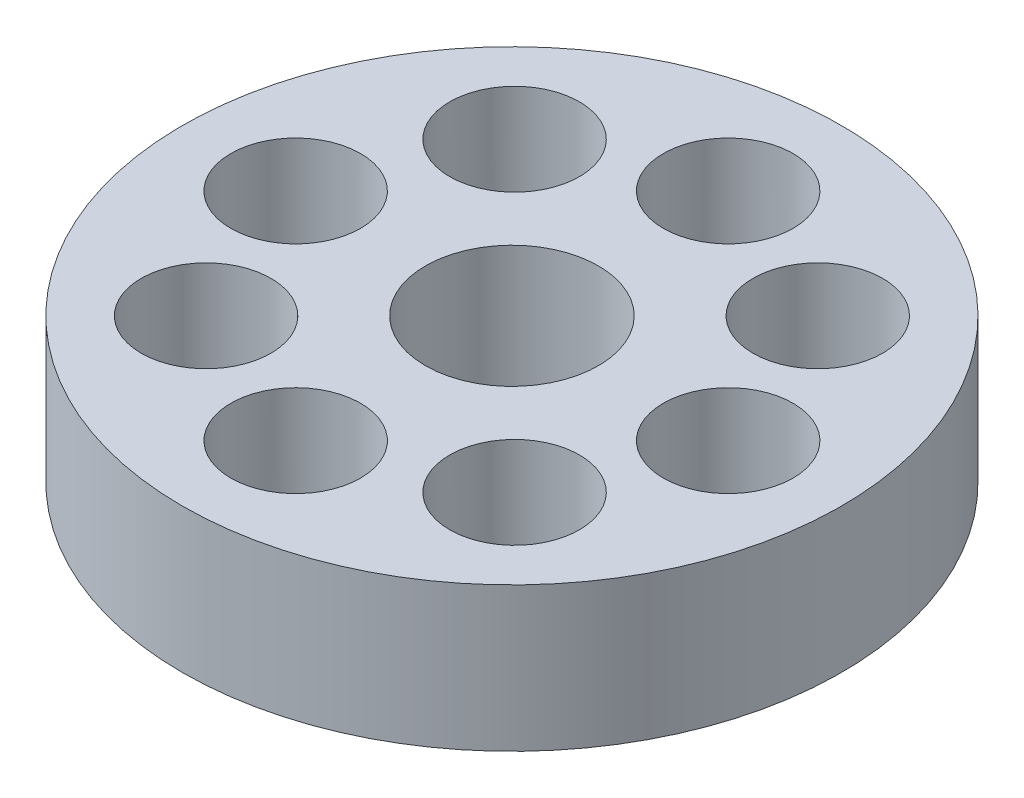
ISO-10303-21;
HEADER;
FILE_DESCRIPTION(('STEP AP214'),'2;1');
FILE_NAME('part.step','',(''),(''),'','','');
FILE_SCHEMA(('AUTOMOTIVE_DESIGN { 1 0 10303 214 1 1 1 1 }'));
ENDSEC;
DATA;
#1=APPLICATION_CONTEXT('core data for automotive mechanical design processes');
#2=APPLICATION_PROTOCOL_DEFINITION('international standard','automotive_design',2000,#1);
#3=PRODUCT_CONTEXT('',#1,'mechanical');
#4=PRODUCT('Part','Part','',(#3));
#5=PRODUCT_RELATED_PRODUCT_CATEGORY('part','',(#4));
#6=PRODUCT_DEFINITION_FORMATION('','',#4);
#7=PRODUCT_DEFINITION_CONTEXT('part definition',#1,'design');
#8=PRODUCT_DEFINITION('design','',#6,#7);
#9=PRODUCT_DEFINITION_SHAPE('','',#8);
#10=(LENGTH_UNIT() NAMED_UNIT(*) SI_UNIT(.MILLI.,.METRE.));
#11=(NAMED_UNIT(*) PLANE_ANGLE_UNIT() SI_UNIT($,.RADIAN.));
#12=(NAMED_UNIT(*) SI_UNIT($,.STERADIAN.) SOLID_ANGLE_UNIT());
#13=UNCERTAINTY_MEASURE_WITH_UNIT(LENGTH_MEASURE(1.E-05),#10,'distance_accuracy_value','');
#14=(GEOMETRIC_REPRESENTATION_CONTEXT(3) GLOBAL_UNCERTAINTY_ASSIGNED_CONTEXT((#13)) GLOBAL_UNIT_ASSIGNED_CONTEXT((#10,
#11,#12)) REPRESENTATION_CONTEXT('',''));
#15=CARTESIAN_POINT('',(0.,0.,0.));
#16=DIRECTION('',(0.,0.,1.));
#17=DIRECTION('',(1.,0.,0.));
#18=AXIS2_PLACEMENT_3D('',#15,#16,#17);
#19=CARTESIAN_POINT('',(0.,0.,0.));
#20=DIRECTION('',(0.,1.,0.));
#21=DIRECTION('',(0.,0.,1.));
#22=AXIS2_PLACEMENT_3D('',#19,#20,#21);
#23=PLANE('',#22);
#24=CARTESIAN_POINT('',(0.,0.,0.));
#25=DIRECTION('',(0.,1.,0.));
#26=DIRECTION('',(0.,0.,1.));
#27=AXIS2_PLACEMENT_3D('',#24,#25,#26);
#28=CIRCLE('',#27,30.);
#29=CARTESIAN_POINT('',(0.,0.,30.));
#30=VERTEX_POINT('',#29);
#31=EDGE_CURVE('E374',#30,#30,#28,.T.);
#32=ORIENTED_EDGE('',*,*,#31,.T.);
#33=EDGE_LOOP('',(#32));
#34=FACE_BOUND('',#33,.T.);
#35=CARTESIAN_POINT('',(0.,0.,0.));
#36=DIRECTION('',(0.,1.,0.));
#37=DIRECTION('',(0.,0.,1.));
#38=AXIS2_PLACEMENT_3D('',#35,#36,#37);
#39=CIRCLE('',#38,60.);
#40=CARTESIAN_POINT('',(14.8823511247383,0.,58.125));
#41=VERTEX_POINT('',#40);
#42=CARTESIAN_POINT('',(31.0217602708352,0.,51.3580606107633));
#43=VERTEX_POINT('',#42);
#44=EDGE_CURVE('E274',#41,#43,#39,.T.);
#45=ORIENTED_EDGE('',*,*,#44,.F.);
#46=CARTESIAN_POINT('',(0.,0.,75.));
#47=DIRECTION('',(0.,1.,0.));
#48=DIRECTION('',(0.,0.,1.));
#49=AXIS2_PLACEMENT_3D('',#46,#47,#48);
#50=CIRCLE('',#49,22.5);
#51=CARTESIAN_POINT('',(-14.8823511247383,0.,58.125));
#52=VERTEX_POINT('',#51);
#53=EDGE_CURVE('E272',#41,#52,#50,.T.);
#54=ORIENTED_EDGE('',*,*,#53,.T.);
#55=CARTESIAN_POINT('',(-30.5790945217529,0.,51.6228532554111));
#56=VERTEX_POINT('',#55);
#57=EDGE_CURVE('E278',#56,#52,#39,.T.);
#58=ORIENTED_EDGE('',*,*,#57,.F.);
#59=CARTESIAN_POINT('',(-53.0349853600991,0.,53.0310317441974));
#60=DIRECTION('',(0.,1.,0.));
#61=DIRECTION('',(0.,0.,1.));
#62=AXIS2_PLACEMENT_3D('',#59,#60,#61);
#63=CIRCLE('',#62,22.5);
#64=CARTESIAN_POINT('',(-51.6251327864007,0.,30.575245948095));
#65=VERTEX_POINT('',#64);
#66=EDGE_CURVE('E398',#56,#65,#63,.T.);
#67=ORIENTED_EDGE('',*,*,#66,.T.);
#68=CARTESIAN_POINT('',(-58.125,0.,14.8823511247383));
#69=VERTEX_POINT('',#68);
#70=EDGE_CURVE('E291',#69,#65,#39,.T.);
#71=ORIENTED_EDGE('',*,*,#70,.F.);
#72=CARTESIAN_POINT('',(-75.,0.,0.));
#73=DIRECTION('',(0.,1.,0.));
#74=DIRECTION('',(0.,0.,1.));
#75=AXIS2_PLACEMENT_3D('',#72,#73,#74);
#76=CIRCLE('',#75,22.5);
#77=CARTESIAN_POINT('',(-58.125,0.,-14.8823511247383));
#78=VERTEX_POINT('',#77);
#79=EDGE_CURVE('E405',#69,#78,#76,.T.);
#80=ORIENTED_EDGE('',*,*,#79,.T.);
#81=CARTESIAN_POINT('',(-51.3580606107636,0.,-31.0217602708346));
#82=VERTEX_POINT('',#81);
#83=EDGE_CURVE('E298',#82,#78,#39,.T.);
#84=ORIENTED_EDGE('',*,*,#83,.F.);
#85=CARTESIAN_POINT('',(-52.5731363363045,0.,-53.4889272257758));
#86=DIRECTION('',(0.,1.,0.));
#87=DIRECTION('',(0.,0.,1.));
#88=AXIS2_PLACEMENT_3D('',#85,#86,#87);
#89=CIRCLE('',#88,22.5);
#90=CARTESIAN_POINT('',(-30.1303007105084,0.,-51.8860769291179));
#91=VERTEX_POINT('',#90);
#92=EDGE_CURVE('E412',#82,#91,#89,.T.);
#93=ORIENTED_EDGE('',*,*,#92,.T.);
#94=CARTESIAN_POINT('',(-14.8823511247383,0.,-58.125));
#95=VERTEX_POINT('',#94);
#96=EDGE_CURVE('E305',#95,#91,#39,.T.);
#97=ORIENTED_EDGE('',*,*,#96,.F.);
#98=CARTESIAN_POINT('',(0.,0.,-75.));
#99=DIRECTION('',(0.,1.,0.));
#100=DIRECTION('',(0.,0.,1.));
#101=AXIS2_PLACEMENT_3D('',#98,#99,#100);
#102=CIRCLE('',#101,22.5);
#103=CARTESIAN_POINT('',(14.8823511247383,0.,-58.125));
#104=VERTEX_POINT('',#103);
#105=EDGE_CURVE('E411',#95,#104,#102,.T.);
#106=ORIENTED_EDGE('',*,*,#105,.T.);
#107=CARTESIAN_POINT('',(30.5752459480947,0.,-51.6251327864008));
#108=VERTEX_POINT('',#107);
#109=EDGE_CURVE('E58',#108,#104,#39,.T.);
#110=ORIENTED_EDGE('',*,*,#109,.F.);
#111=CARTESIAN_POINT('',(53.0310317441972,0.,-53.0349853600993));
#112=DIRECTION('',(0.,1.,0.));
#113=DIRECTION('',(0.,0.,1.));
#114=AXIS2_PLACEMENT_3D('',#111,#112,#113);
#115=CIRCLE('',#114,22.5);
#116=CARTESIAN_POINT('',(51.6228532554109,0.,-30.5790945217531));
#117=VERTEX_POINT('',#116);
#118=EDGE_CURVE('E418',#108,#117,#115,.T.);
#119=ORIENTED_EDGE('',*,*,#118,.T.);
#120=CARTESIAN_POINT('',(58.125,0.,-14.8823511247383));
#121=VERTEX_POINT('',#120);
#122=EDGE_CURVE('E50',#121,#117,#39,.T.);
#123=ORIENTED_EDGE('',*,*,#122,.F.);
#124=CARTESIAN_POINT('',(75.,0.,0.));
#125=DIRECTION('',(0.,1.,0.));
#126=DIRECTION('',(0.,0.,1.));
#127=AXIS2_PLACEMENT_3D('',#124,#125,#126);
#128=CIRCLE('',#127,22.5);
#129=CARTESIAN_POINT('',(58.125,0.,14.8823511247383));
#130=VERTEX_POINT('',#129);
#131=EDGE_CURVE('E425',#121,#130,#128,.T.);
#132=ORIENTED_EDGE('',*,*,#131,.T.);
#133=CARTESIAN_POINT('',(51.8860769291182,0.,30.1303007105078));
#134=VERTEX_POINT('',#133);
#135=EDGE_CURVE('E273',#134,#130,#39,.T.);
#136=ORIENTED_EDGE('',*,*,#135,.F.);
#137=CARTESIAN_POINT('',(53.4889272257764,0.,52.5731363363039));
#138=DIRECTION('',(0.,1.,0.));
#139=DIRECTION('',(0.,0.,1.));
#140=AXIS2_PLACEMENT_3D('',#137,#138,#139);
#141=CIRCLE('',#140,22.5);
#142=EDGE_CURVE('E385',#134,#43,#141,.T.);
#143=ORIENTED_EDGE('',*,*,#142,.T.);
#144=EDGE_LOOP('',(#45,#54,#58,#67,#71,#80,#84,#93,#97,#106,#110,#119,#123,#132,#136,#143));
#145=FACE_BOUND('',#144,.T.);
#146=ADVANCED_FACE('F35',(#34,#145),#23,.F.);
#147=CARTESIAN_POINT('',(0.,50.,0.));
#148=DIRECTION('',(0.,1.,0.));
#149=DIRECTION('',(0.,0.,1.));
#150=AXIS2_PLACEMENT_3D('',#147,#148,#149);
#151=PLANE('',#150);
#152=CARTESIAN_POINT('',(53.4889272257764,50.,52.5731363363039));
#153=DIRECTION('',(0.,1.,0.));
#154=DIRECTION('',(0.,0.,1.));
#155=AXIS2_PLACEMENT_3D('',#152,#153,#154);
#156=CIRCLE('',#155,22.5);
#157=CARTESIAN_POINT('',(53.4889272257764,50.,75.0731363363039));
#158=VERTEX_POINT('',#157);
#159=EDGE_CURVE('E381',#158,#158,#156,.T.);
#160=ORIENTED_EDGE('',*,*,#159,.F.);
#161=EDGE_LOOP('',(#160));
#162=FACE_BOUND('',#161,.T.);
#163=CARTESIAN_POINT('',(-53.0349853600991,50.,53.0310317441974));
#164=DIRECTION('',(0.,1.,0.));
#165=DIRECTION('',(0.,0.,1.));
#166=AXIS2_PLACEMENT_3D('',#163,#164,#165);
#167=CIRCLE('',#166,22.5);
#168=CARTESIAN_POINT('',(-53.0349853600991,50.,75.5310317441974));
#169=VERTEX_POINT('',#168);
#170=EDGE_CURVE('E394',#169,#169,#167,.T.);
#171=ORIENTED_EDGE('',*,*,#170,.F.);
#172=EDGE_LOOP('',(#171));
#173=FACE_BOUND('',#172,.T.);
#174=CARTESIAN_POINT('',(-52.5731363363045,50.,-53.4889272257758));
#175=DIRECTION('',(0.,1.,0.));
#176=DIRECTION('',(0.,0.,1.));
#177=AXIS2_PLACEMENT_3D('',#174,#175,#176);
#178=CIRCLE('',#177,22.5);
#179=CARTESIAN_POINT('',(-52.5731363363045,50.,-30.9889272257758));
#180=VERTEX_POINT('',#179);
#181=EDGE_CURVE('E408',#180,#180,#178,.T.);
#182=ORIENTED_EDGE('',*,*,#181,.F.);
#183=EDGE_LOOP('',(#182));
#184=FACE_BOUND('',#183,.T.);
#185=CARTESIAN_POINT('',(53.0310317441972,50.,-53.0349853600993));
#186=DIRECTION('',(0.,1.,0.));
#187=DIRECTION('',(0.,0.,1.));
#188=AXIS2_PLACEMENT_3D('',#185,#186,#187);
#189=CIRCLE('',#188,22.5);
#190=CARTESIAN_POINT('',(53.0310317441972,50.,-30.5349853600993));
#191=VERTEX_POINT('',#190);
#192=EDGE_CURVE('E422',#191,#191,#189,.T.);
#193=ORIENTED_EDGE('',*,*,#192,.F.);
#194=EDGE_LOOP('',(#193));
#195=FACE_BOUND('',#194,.T.);
#196=CARTESIAN_POINT('',(0.,50.,0.));
#197=DIRECTION('',(0.,1.,0.));
#198=DIRECTION('',(0.,0.,1.));
#199=AXIS2_PLACEMENT_3D('',#196,#197,#198);
#200=CIRCLE('',#199,114.3);
#201=CARTESIAN_POINT('',(0.,50.,114.3));
#202=VERTEX_POINT('',#201);
#203=EDGE_CURVE('E436',#202,#202,#200,.T.);
#204=ORIENTED_EDGE('',*,*,#203,.T.);
#205=EDGE_LOOP('',(#204));
#206=FACE_BOUND('',#205,.T.);
#207=CARTESIAN_POINT('',(75.,50.,0.));
#208=DIRECTION('',(0.,1.,0.));
#209=DIRECTION('',(0.,0.,1.));
#210=AXIS2_PLACEMENT_3D('',#207,#208,#209);
#211=CIRCLE('',#210,22.5);
#212=CARTESIAN_POINT('',(75.,50.,22.5));
#213=VERTEX_POINT('',#212);
#214=EDGE_CURVE('E429',#213,#213,#211,.T.);
#215=ORIENTED_EDGE('',*,*,#214,.F.);
#216=EDGE_LOOP('',(#215));
#217=FACE_BOUND('',#216,.T.);
#218=CARTESIAN_POINT('',(0.,50.,-75.));
#219=DIRECTION('',(0.,1.,0.));
#220=DIRECTION('',(0.,0.,1.));
#221=AXIS2_PLACEMENT_3D('',#218,#219,#220);
#222=CIRCLE('',#221,22.5);
#223=CARTESIAN_POINT('',(0.,50.,-52.5));
#224=VERTEX_POINT('',#223);
#225=EDGE_CURVE('E415',#224,#224,#222,.T.);
#226=ORIENTED_EDGE('',*,*,#225,.F.);
#227=EDGE_LOOP('',(#226));
#228=FACE_BOUND('',#227,.T.);
#229=CARTESIAN_POINT('',(-75.,50.,0.));
#230=DIRECTION('',(0.,1.,0.));
#231=DIRECTION('',(0.,0.,1.));
#232=AXIS2_PLACEMENT_3D('',#229,#230,#231);
#233=CIRCLE('',#232,22.5);
#234=CARTESIAN_POINT('',(-75.,50.,22.5));
#235=VERTEX_POINT('',#234);
#236=EDGE_CURVE('E401',#235,#235,#233,.T.);
#237=ORIENTED_EDGE('',*,*,#236,.F.);
#238=EDGE_LOOP('',(#237));
#239=FACE_BOUND('',#238,.T.);
#240=CARTESIAN_POINT('',(0.,50.,75.));
#241=DIRECTION('',(0.,1.,0.));
#242=DIRECTION('',(0.,0.,1.));
#243=AXIS2_PLACEMENT_3D('',#240,#241,#242);
#244=CIRCLE('',#243,22.5);
#245=CARTESIAN_POINT('',(0.,50.,97.5));
#246=VERTEX_POINT('',#245);
#247=EDGE_CURVE('E388',#246,#246,#244,.T.);
#248=ORIENTED_EDGE('',*,*,#247,.F.);
#249=EDGE_LOOP('',(#248));
#250=FACE_BOUND('',#249,.T.);
#251=CARTESIAN_POINT('',(0.,50.,0.));
#252=DIRECTION('',(0.,1.,0.));
#253=DIRECTION('',(0.,0.,1.));
#254=AXIS2_PLACEMENT_3D('',#251,#252,#253);
#255=CIRCLE('',#254,30.);
#256=CARTESIAN_POINT('',(0.,50.,30.));
#257=VERTEX_POINT('',#256);
#258=EDGE_CURVE('E375',#257,#257,#255,.T.);
#259=ORIENTED_EDGE('',*,*,#258,.F.);
#260=EDGE_LOOP('',(#259));
#261=FACE_BOUND('',#260,.T.);
#262=ADVANCED_FACE('F608',(#162,#173,#184,#195,#206,#217,#228,#239,#250,#261),#151,.T.);
#263=CARTESIAN_POINT('',(0.,0.,0.));
#264=DIRECTION('',(0.,1.,0.));
#265=DIRECTION('',(0.,0.,1.));
#266=AXIS2_PLACEMENT_3D('',#263,#264,#265);
#267=CIRCLE('',#266,114.3);
#268=CARTESIAN_POINT('',(0.,0.,114.3));
#269=VERTEX_POINT('',#268);
#270=EDGE_CURVE('E432',#269,#269,#267,.T.);
#271=ORIENTED_EDGE('',*,*,#270,.F.);
#272=EDGE_LOOP('',(#271));
#273=FACE_BOUND('',#272,.T.);
#274=CARTESIAN_POINT('',(-18.2752393965168,0.,88.125));
#275=VERTEX_POINT('',#274);
#276=CARTESIAN_POINT('',(18.2752393965168,0.,88.125));
#277=VERTEX_POINT('',#276);
#278=EDGE_CURVE('E384',#275,#277,#50,.T.);
#279=ORIENTED_EDGE('',*,*,#278,.T.);
#280=CARTESIAN_POINT('',(0.,0.,0.));
#281=DIRECTION('',(0.,1.,0.));
#282=DIRECTION('',(0.,0.,1.));
#283=AXIS2_PLACEMENT_3D('',#280,#281,#282);
#284=CIRCLE('',#283,90.);
#285=CARTESIAN_POINT('',(50.0390007919983,0.,74.8070745300095));
#286=VERTEX_POINT('',#285);
#287=EDGE_CURVE('E336',#277,#286,#284,.T.);
#288=ORIENTED_EDGE('',*,*,#287,.T.);
#289=CARTESIAN_POINT('',(75.6599781885762,0.,48.7397958603048));
#290=VERTEX_POINT('',#289);
#291=EDGE_CURVE('E378',#286,#290,#141,.T.);
#292=ORIENTED_EDGE('',*,*,#291,.T.);
#293=CARTESIAN_POINT('',(88.125,0.,18.2752393965168));
#294=VERTEX_POINT('',#293);
#295=EDGE_CURVE('E341',#290,#294,#284,.T.);
#296=ORIENTED_EDGE('',*,*,#295,.T.);
#297=CARTESIAN_POINT('',(88.125,0.,-18.2752393965168));
#298=VERTEX_POINT('',#297);
#299=EDGE_CURVE('E433',#294,#298,#128,.T.);
#300=ORIENTED_EDGE('',*,*,#299,.T.);
#301=CARTESIAN_POINT('',(75.2344896840528,0.,-49.3940437905235));
#302=VERTEX_POINT('',#301);
#303=EDGE_CURVE('E340',#298,#302,#284,.T.);
#304=ORIENTED_EDGE('',*,*,#303,.T.);
#305=CARTESIAN_POINT('',(49.3884349148106,0.,-75.2381718057099));
#306=VERTEX_POINT('',#305);
#307=EDGE_CURVE('E426',#302,#306,#115,.T.);
#308=ORIENTED_EDGE('',*,*,#307,.T.);
#309=CARTESIAN_POINT('',(18.2752393965168,0.,-88.125));
#310=VERTEX_POINT('',#309);
#311=EDGE_CURVE('E367',#306,#310,#284,.T.);
#312=ORIENTED_EDGE('',*,*,#311,.T.);
#313=CARTESIAN_POINT('',(-18.2752393965168,0.,-88.125));
#314=VERTEX_POINT('',#313);
#315=EDGE_CURVE('E419',#310,#314,#102,.T.);
#316=ORIENTED_EDGE('',*,*,#315,.T.);
#317=CARTESIAN_POINT('',(-48.7397958603055,0.,-75.6599781885757));
#318=VERTEX_POINT('',#317);
#319=EDGE_CURVE('E362',#314,#318,#284,.T.);
#320=ORIENTED_EDGE('',*,*,#319,.T.);
#321=CARTESIAN_POINT('',(-74.80707453001,0.,-50.0390007919975));
#322=VERTEX_POINT('',#321);
#323=EDGE_CURVE('E404',#318,#322,#89,.T.);
#324=ORIENTED_EDGE('',*,*,#323,.T.);
#325=CARTESIAN_POINT('',(-88.125,0.,-18.2752393965168));
#326=VERTEX_POINT('',#325);
#327=EDGE_CURVE('E357',#322,#326,#284,.T.);
#328=ORIENTED_EDGE('',*,*,#327,.T.);
#329=CARTESIAN_POINT('',(-88.125,0.,18.2752393965168));
#330=VERTEX_POINT('',#329);
#331=EDGE_CURVE('E397',#326,#330,#76,.T.);
#332=ORIENTED_EDGE('',*,*,#331,.T.);
#333=CARTESIAN_POINT('',(-75.2381718057096,0.,49.388434914811));
#334=VERTEX_POINT('',#333);
#335=EDGE_CURVE('E352',#330,#334,#284,.T.);
#336=ORIENTED_EDGE('',*,*,#335,.T.);
#337=CARTESIAN_POINT('',(-49.3940437905232,0.,75.234489684053));
#338=VERTEX_POINT('',#337);
#339=EDGE_CURVE('E391',#334,#338,#63,.T.);
#340=ORIENTED_EDGE('',*,*,#339,.T.);
#341=EDGE_CURVE('E347',#338,#275,#284,.T.);
#342=ORIENTED_EDGE('',*,*,#341,.T.);
#343=EDGE_LOOP('',(#279,#288,#292,#296,#300,#304,#308,#312,#316,#320,#324,#328,#332,#336,#340,#342));
#344=FACE_BOUND('',#343,.T.);
#345=ADVANCED_FACE('F466',(#273,#344),#23,.F.);
#346=CARTESIAN_POINT('',(0.,50.,0.));
#347=DIRECTION('',(0.,-1.,0.));
#348=DIRECTION('',(0.,0.,-1.));
#349=AXIS2_PLACEMENT_3D('',#346,#347,#348);
#350=CYLINDRICAL_SURFACE('',#349,114.3);
#351=ORIENTED_EDGE('',*,*,#203,.F.);
#352=EDGE_LOOP('',(#351));
#353=FACE_BOUND('',#352,.T.);
#354=ORIENTED_EDGE('',*,*,#270,.T.);
#355=EDGE_LOOP('',(#354));
#356=FACE_BOUND('',#355,.T.);
#357=ADVANCED_FACE('F37',(#353,#356),#350,.T.);
#358=CARTESIAN_POINT('',(75.,50.,0.));
#359=DIRECTION('',(0.,-1.,0.));
#360=DIRECTION('',(0.,0.,-1.));
#361=AXIS2_PLACEMENT_3D('',#358,#359,#360);
#362=CYLINDRICAL_SURFACE('',#361,22.5);
#363=DIRECTION('',(0.,1.,0.));
#364=VECTOR('',#363,1.);
#365=CARTESIAN_POINT('',(88.125,5.,-18.2752393965168));
#366=LINE('',#365,#364);
#367=CARTESIAN_POINT('',(88.125,15.,-18.2752393965167));
#368=VERTEX_POINT('',#367);
#369=EDGE_CURVE('E372',#298,#368,#366,.T.);
#370=ORIENTED_EDGE('',*,*,#369,.F.);
#371=ORIENTED_EDGE('',*,*,#299,.F.);
#372=DIRECTION('',(0.,1.,0.));
#373=VECTOR('',#372,1.);
#374=CARTESIAN_POINT('',(88.125,5.,18.2752393965168));
#375=LINE('',#374,#373);
#376=CARTESIAN_POINT('',(88.125,15.,18.2752393965167));
#377=VERTEX_POINT('',#376);
#378=EDGE_CURVE('E343',#377,#294,#375,.F.);
#379=ORIENTED_EDGE('',*,*,#378,.F.);
#380=CARTESIAN_POINT('',(75.,15.,0.));
#381=DIRECTION('',(0.,1.,0.));
#382=DIRECTION('',(0.,0.,1.));
#383=AXIS2_PLACEMENT_3D('',#380,#381,#382);
#384=CIRCLE('',#383,22.5);
#385=CARTESIAN_POINT('',(58.125,15.,14.8823511247383));
#386=VERTEX_POINT('',#385);
#387=EDGE_CURVE('E333',#386,#377,#384,.T.);
#388=ORIENTED_EDGE('',*,*,#387,.F.);
#389=DIRECTION('',(0.,1.,0.));
#390=VECTOR('',#389,1.);
#391=CARTESIAN_POINT('',(58.125,5.,14.8823511247383));
#392=LINE('',#391,#390);
#393=EDGE_CURVE('E276',#386,#130,#392,.F.);
#394=ORIENTED_EDGE('',*,*,#393,.T.);
#395=ORIENTED_EDGE('',*,*,#131,.F.);
#396=DIRECTION('',(0.,1.,0.));
#397=VECTOR('',#396,1.);
#398=CARTESIAN_POINT('',(58.125,5.,-14.8823511247383));
#399=LINE('',#398,#397);
#400=CARTESIAN_POINT('',(58.125,15.,-14.8823511247383));
#401=VERTEX_POINT('',#400);
#402=EDGE_CURVE('E316',#121,#401,#399,.T.);
#403=ORIENTED_EDGE('',*,*,#402,.T.);
#404=EDGE_CURVE('E335',#368,#401,#384,.T.);
#405=ORIENTED_EDGE('',*,*,#404,.F.);
#406=EDGE_LOOP('',(#370,#371,#379,#388,#394,#395,#403,#405));
#407=FACE_BOUND('',#406,.T.);
#408=ORIENTED_EDGE('',*,*,#214,.T.);
#409=EDGE_LOOP('',(#408));
#410=FACE_BOUND('',#409,.T.);
#411=ADVANCED_FACE('F589',(#407,#410),#362,.F.);
#412=CARTESIAN_POINT('',(53.0310317441972,50.,-53.0349853600993));
#413=DIRECTION('',(0.,-1.,0.));
#414=DIRECTION('',(0.,0.,-1.));
#415=AXIS2_PLACEMENT_3D('',#412,#413,#414);
#416=CYLINDRICAL_SURFACE('',#415,22.5);
#417=DIRECTION('',(0.,1.,0.));
#418=VECTOR('',#417,1.);
#419=CARTESIAN_POINT('',(49.3884349148106,5.,-75.2381718057099));
#420=LINE('',#419,#418);
#421=CARTESIAN_POINT('',(49.3884349148107,15.,-75.2381718057099));
#422=VERTEX_POINT('',#421);
#423=EDGE_CURVE('E368',#306,#422,#420,.T.);
#424=ORIENTED_EDGE('',*,*,#423,.F.);
#425=ORIENTED_EDGE('',*,*,#307,.F.);
#426=DIRECTION('',(0.,1.,0.));
#427=VECTOR('',#426,1.);
#428=CARTESIAN_POINT('',(75.2344896840528,5.,-49.3940437905235));
#429=LINE('',#428,#427);
#430=CARTESIAN_POINT('',(75.2344896840527,15.,-49.3940437905236));
#431=VERTEX_POINT('',#430);
#432=EDGE_CURVE('E370',#431,#302,#429,.F.);
#433=ORIENTED_EDGE('',*,*,#432,.F.);
#434=CARTESIAN_POINT('',(53.0310317441972,15.,-53.0349853600993));
#435=DIRECTION('',(0.,1.,0.));
#436=DIRECTION('',(0.,0.,1.));
#437=AXIS2_PLACEMENT_3D('',#434,#435,#436);
#438=CIRCLE('',#437,22.5);
#439=CARTESIAN_POINT('',(51.6228532554109,15.,-30.5790945217531));
#440=VERTEX_POINT('',#439);
#441=EDGE_CURVE('E330',#440,#431,#438,.T.);
#442=ORIENTED_EDGE('',*,*,#441,.F.);
#443=DIRECTION('',(0.,1.,0.));
#444=VECTOR('',#443,1.);
#445=CARTESIAN_POINT('',(51.6228532554109,5.,-30.5790945217531));
#446=LINE('',#445,#444);
#447=EDGE_CURVE('E314',#440,#117,#446,.F.);
#448=ORIENTED_EDGE('',*,*,#447,.T.);
#449=ORIENTED_EDGE('',*,*,#118,.F.);
#450=DIRECTION('',(0.,1.,0.));
#451=VECTOR('',#450,1.);
#452=CARTESIAN_POINT('',(30.5752459480947,5.,-51.6251327864008));
#453=LINE('',#452,#451);
#454=CARTESIAN_POINT('',(30.5752459480947,15.,-51.6251327864008));
#455=VERTEX_POINT('',#454);
#456=EDGE_CURVE('E311',#108,#455,#453,.T.);
#457=ORIENTED_EDGE('',*,*,#456,.T.);
#458=EDGE_CURVE('E332',#422,#455,#438,.T.);
#459=ORIENTED_EDGE('',*,*,#458,.F.);
#460=EDGE_LOOP('',(#424,#425,#433,#442,#448,#449,#457,#459));
#461=FACE_BOUND('',#460,.T.);
#462=ORIENTED_EDGE('',*,*,#192,.T.);
#463=EDGE_LOOP('',(#462));
#464=FACE_BOUND('',#463,.T.);
#465=ADVANCED_FACE('F497',(#461,#464),#416,.F.);
#466=CARTESIAN_POINT('',(0.,50.,-75.));
#467=DIRECTION('',(0.,-1.,0.));
#468=DIRECTION('',(0.,0.,-1.));
#469=AXIS2_PLACEMENT_3D('',#466,#467,#468);
#470=CYLINDRICAL_SURFACE('',#469,22.5);
#471=DIRECTION('',(0.,1.,0.));
#472=VECTOR('',#471,1.);
#473=CARTESIAN_POINT('',(-18.2752393965168,5.,-88.125));
#474=LINE('',#473,#472);
#475=CARTESIAN_POINT('',(-18.2752393965168,15.,-88.125));
#476=VERTEX_POINT('',#475);
#477=EDGE_CURVE('E363',#314,#476,#474,.T.);
#478=ORIENTED_EDGE('',*,*,#477,.F.);
#479=ORIENTED_EDGE('',*,*,#315,.F.);
#480=DIRECTION('',(0.,1.,0.));
#481=VECTOR('',#480,1.);
#482=CARTESIAN_POINT('',(18.2752393965168,5.,-88.125));
#483=LINE('',#482,#481);
#484=CARTESIAN_POINT('',(18.2752393965168,15.,-88.125));
#485=VERTEX_POINT('',#484);
#486=EDGE_CURVE('E365',#485,#310,#483,.F.);
#487=ORIENTED_EDGE('',*,*,#486,.F.);
#488=CARTESIAN_POINT('',(0.,15.,-75.));
#489=DIRECTION('',(0.,1.,0.));
#490=DIRECTION('',(0.,0.,1.));
#491=AXIS2_PLACEMENT_3D('',#488,#489,#490);
#492=CIRCLE('',#491,22.5);
#493=CARTESIAN_POINT('',(14.8823511247383,15.,-58.125));
#494=VERTEX_POINT('',#493);
#495=EDGE_CURVE('E329',#494,#485,#492,.T.);
#496=ORIENTED_EDGE('',*,*,#495,.F.);
#497=DIRECTION('',(0.,1.,0.));
#498=VECTOR('',#497,1.);
#499=CARTESIAN_POINT('',(14.8823511247383,5.,-58.125));
#500=LINE('',#499,#498);
#501=EDGE_CURVE('E309',#494,#104,#500,.F.);
#502=ORIENTED_EDGE('',*,*,#501,.T.);
#503=ORIENTED_EDGE('',*,*,#105,.F.);
#504=DIRECTION('',(0.,1.,0.));
#505=VECTOR('',#504,1.);
#506=CARTESIAN_POINT('',(-14.8823511247383,5.,-58.125));
#507=LINE('',#506,#505);
#508=CARTESIAN_POINT('',(-14.8823511247383,15.,-58.125));
#509=VERTEX_POINT('',#508);
#510=EDGE_CURVE('E306',#95,#509,#507,.T.);
#511=ORIENTED_EDGE('',*,*,#510,.T.);
#512=EDGE_CURVE('E327',#476,#509,#492,.T.);
#513=ORIENTED_EDGE('',*,*,#512,.F.);
#514=EDGE_LOOP('',(#478,#479,#487,#496,#502,#503,#511,#513));
#515=FACE_BOUND('',#514,.T.);
#516=ORIENTED_EDGE('',*,*,#225,.T.);
#517=EDGE_LOOP('',(#516));
#518=FACE_BOUND('',#517,.T.);
#519=ADVANCED_FACE('F663',(#515,#518),#470,.F.);
#520=CARTESIAN_POINT('',(-52.5731363363045,50.,-53.4889272257758));
#521=DIRECTION('',(0.,-1.,0.));
#522=DIRECTION('',(0.,0.,-1.));
#523=AXIS2_PLACEMENT_3D('',#520,#521,#522);
#524=CYLINDRICAL_SURFACE('',#523,22.5);
#525=DIRECTION('',(0.,1.,0.));
#526=VECTOR('',#525,1.);
#527=CARTESIAN_POINT('',(-74.80707453001,5.,-50.0390007919975));
#528=LINE('',#527,#526);
#529=CARTESIAN_POINT('',(-74.80707453001,15.,-50.0390007919975));
#530=VERTEX_POINT('',#529);
#531=EDGE_CURVE('E358',#322,#530,#528,.T.);
#532=ORIENTED_EDGE('',*,*,#531,.F.);
#533=ORIENTED_EDGE('',*,*,#323,.F.);
#534=DIRECTION('',(0.,1.,0.));
#535=VECTOR('',#534,1.);
#536=CARTESIAN_POINT('',(-48.7397958603055,5.,-75.6599781885757));
#537=LINE('',#536,#535);
#538=CARTESIAN_POINT('',(-48.7397958603055,15.,-75.6599781885757));
#539=VERTEX_POINT('',#538);
#540=EDGE_CURVE('E360',#539,#318,#537,.F.);
#541=ORIENTED_EDGE('',*,*,#540,.F.);
#542=CARTESIAN_POINT('',(-52.5731363363045,15.,-53.4889272257758));
#543=DIRECTION('',(0.,1.,0.));
#544=DIRECTION('',(0.,0.,1.));
#545=AXIS2_PLACEMENT_3D('',#542,#543,#544);
#546=CIRCLE('',#545,22.5);
#547=CARTESIAN_POINT('',(-30.1303007105083,15.,-51.8860769291179));
#548=VERTEX_POINT('',#547);
#549=EDGE_CURVE('E326',#548,#539,#546,.T.);
#550=ORIENTED_EDGE('',*,*,#549,.F.);
#551=DIRECTION('',(0.,1.,0.));
#552=VECTOR('',#551,1.);
#553=CARTESIAN_POINT('',(-30.1303007105084,5.,-51.8860769291179));
#554=LINE('',#553,#552);
#555=EDGE_CURVE('E302',#548,#91,#554,.F.);
#556=ORIENTED_EDGE('',*,*,#555,.T.);
#557=ORIENTED_EDGE('',*,*,#92,.F.);
#558=DIRECTION('',(0.,1.,0.));
#559=VECTOR('',#558,1.);
#560=CARTESIAN_POINT('',(-51.3580606107636,5.,-31.0217602708346));
#561=LINE('',#560,#559);
#562=CARTESIAN_POINT('',(-51.3580606107636,15.,-31.0217602708346));
#563=VERTEX_POINT('',#562);
#564=EDGE_CURVE('E299',#82,#563,#561,.T.);
#565=ORIENTED_EDGE('',*,*,#564,.T.);
#566=EDGE_CURVE('E324',#530,#563,#546,.T.);
#567=ORIENTED_EDGE('',*,*,#566,.F.);
#568=EDGE_LOOP('',(#532,#533,#541,#550,#556,#557,#565,#567));
#569=FACE_BOUND('',#568,.T.);
#570=ORIENTED_EDGE('',*,*,#181,.T.);
#571=EDGE_LOOP('',(#570));
#572=FACE_BOUND('',#571,.T.);
#573=ADVANCED_FACE('F660',(#569,#572),#524,.F.);
#574=CARTESIAN_POINT('',(-75.,50.,0.));
#575=DIRECTION('',(0.,-1.,0.));
#576=DIRECTION('',(0.,0.,-1.));
#577=AXIS2_PLACEMENT_3D('',#574,#575,#576);
#578=CYLINDRICAL_SURFACE('',#577,22.5);
#579=DIRECTION('',(0.,1.,0.));
#580=VECTOR('',#579,1.);
#581=CARTESIAN_POINT('',(-88.125,5.,18.2752393965168));
#582=LINE('',#581,#580);
#583=CARTESIAN_POINT('',(-88.125,15.,18.2752393965168));
#584=VERTEX_POINT('',#583);
#585=EDGE_CURVE('E353',#330,#584,#582,.T.);
#586=ORIENTED_EDGE('',*,*,#585,.F.);
#587=ORIENTED_EDGE('',*,*,#331,.F.);
#588=DIRECTION('',(0.,1.,0.));
#589=VECTOR('',#588,1.);
#590=CARTESIAN_POINT('',(-88.125,5.,-18.2752393965168));
#591=LINE('',#590,#589);
#592=CARTESIAN_POINT('',(-88.125,15.,-18.2752393965168));
#593=VERTEX_POINT('',#592);
#594=EDGE_CURVE('E355',#593,#326,#591,.F.);
#595=ORIENTED_EDGE('',*,*,#594,.F.);
#596=CARTESIAN_POINT('',(-75.,15.,0.));
#597=DIRECTION('',(0.,1.,0.));
#598=DIRECTION('',(0.,0.,1.));
#599=AXIS2_PLACEMENT_3D('',#596,#597,#598);
#600=CIRCLE('',#599,22.5);
#601=CARTESIAN_POINT('',(-58.125,15.,-14.8823511247383));
#602=VERTEX_POINT('',#601);
#603=EDGE_CURVE('E323',#602,#593,#600,.T.);
#604=ORIENTED_EDGE('',*,*,#603,.F.);
#605=DIRECTION('',(0.,1.,0.));
#606=VECTOR('',#605,1.);
#607=CARTESIAN_POINT('',(-58.125,5.,-14.8823511247383));
#608=LINE('',#607,#606);
#609=EDGE_CURVE('E295',#602,#78,#608,.F.);
#610=ORIENTED_EDGE('',*,*,#609,.T.);
#611=ORIENTED_EDGE('',*,*,#79,.F.);
#612=DIRECTION('',(0.,1.,0.));
#613=VECTOR('',#612,1.);
#614=CARTESIAN_POINT('',(-58.125,5.,14.8823511247383));
#615=LINE('',#614,#613);
#616=CARTESIAN_POINT('',(-58.125,15.,14.8823511247383));
#617=VERTEX_POINT('',#616);
#618=EDGE_CURVE('E292',#69,#617,#615,.T.);
#619=ORIENTED_EDGE('',*,*,#618,.T.);
#620=EDGE_CURVE('E321',#584,#617,#600,.T.);
#621=ORIENTED_EDGE('',*,*,#620,.F.);
#622=EDGE_LOOP('',(#586,#587,#595,#604,#610,#611,#619,#621));
#623=FACE_BOUND('',#622,.T.);
#624=ORIENTED_EDGE('',*,*,#236,.T.);
#625=EDGE_LOOP('',(#624));
#626=FACE_BOUND('',#625,.T.);
#627=ADVANCED_FACE('F533',(#623,#626),#578,.F.);
#628=CARTESIAN_POINT('',(-53.0349853600991,50.,53.0310317441974));
#629=DIRECTION('',(0.,-1.,0.));
#630=DIRECTION('',(0.,0.,-1.));
#631=AXIS2_PLACEMENT_3D('',#628,#629,#630);
#632=CYLINDRICAL_SURFACE('',#631,22.5);
#633=DIRECTION('',(0.,1.,0.));
#634=VECTOR('',#633,1.);
#635=CARTESIAN_POINT('',(-49.3940437905232,5.,75.234489684053));
#636=LINE('',#635,#634);
#637=CARTESIAN_POINT('',(-49.3940437905232,15.,75.234489684053));
#638=VERTEX_POINT('',#637);
#639=EDGE_CURVE('E348',#338,#638,#636,.T.);
#640=ORIENTED_EDGE('',*,*,#639,.F.);
#641=ORIENTED_EDGE('',*,*,#339,.F.);
#642=DIRECTION('',(0.,1.,0.));
#643=VECTOR('',#642,1.);
#644=CARTESIAN_POINT('',(-75.2381718057096,5.,49.388434914811));
#645=LINE('',#644,#643);
#646=CARTESIAN_POINT('',(-75.2381718057096,15.,49.388434914811));
#647=VERTEX_POINT('',#646);
#648=EDGE_CURVE('E350',#647,#334,#645,.F.);
#649=ORIENTED_EDGE('',*,*,#648,.F.);
#650=CARTESIAN_POINT('',(-53.0349853600991,15.,53.0310317441974));
#651=DIRECTION('',(0.,1.,0.));
#652=DIRECTION('',(0.,0.,1.));
#653=AXIS2_PLACEMENT_3D('',#650,#651,#652);
#654=CIRCLE('',#653,22.5);
#655=CARTESIAN_POINT('',(-51.6251327864007,15.,30.575245948095));
#656=VERTEX_POINT('',#655);
#657=EDGE_CURVE('E254',#656,#647,#654,.T.);
#658=ORIENTED_EDGE('',*,*,#657,.F.);
#659=DIRECTION('',(0.,1.,0.));
#660=VECTOR('',#659,1.);
#661=CARTESIAN_POINT('',(-51.6251327864007,5.,30.575245948095));
#662=LINE('',#661,#660);
#663=EDGE_CURVE('E288',#656,#65,#662,.F.);
#664=ORIENTED_EDGE('',*,*,#663,.T.);
#665=ORIENTED_EDGE('',*,*,#66,.F.);
#666=DIRECTION('',(0.,1.,0.));
#667=VECTOR('',#666,1.);
#668=CARTESIAN_POINT('',(-30.5790945217529,5.,51.622853255411));
#669=LINE('',#668,#667);
#670=CARTESIAN_POINT('',(-30.5790945217529,15.,51.622853255411));
#671=VERTEX_POINT('',#670);
#672=EDGE_CURVE('E285',#56,#671,#669,.T.);
#673=ORIENTED_EDGE('',*,*,#672,.T.);
#674=EDGE_CURVE('E320',#638,#671,#654,.T.);
#675=ORIENTED_EDGE('',*,*,#674,.F.);
#676=EDGE_LOOP('',(#640,#641,#649,#658,#664,#665,#673,#675));
#677=FACE_BOUND('',#676,.T.);
#678=ORIENTED_EDGE('',*,*,#170,.T.);
#679=EDGE_LOOP('',(#678));
#680=FACE_BOUND('',#679,.T.);
#681=ADVANCED_FACE('F544',(#677,#680),#632,.F.);
#682=CARTESIAN_POINT('',(0.,50.,75.));
#683=DIRECTION('',(0.,-1.,0.));
#684=DIRECTION('',(0.,0.,-1.));
#685=AXIS2_PLACEMENT_3D('',#682,#683,#684);
#686=CYLINDRICAL_SURFACE('',#685,22.5);
#687=DIRECTION('',(0.,1.,0.));
#688=VECTOR('',#687,1.);
#689=CARTESIAN_POINT('',(18.2752393965168,5.,88.125));
#690=LINE('',#689,#688);
#691=CARTESIAN_POINT('',(18.2752393965168,15.,88.125));
#692=VERTEX_POINT('',#691);
#693=EDGE_CURVE('E339',#277,#692,#690,.T.);
#694=ORIENTED_EDGE('',*,*,#693,.F.);
#695=ORIENTED_EDGE('',*,*,#278,.F.);
#696=DIRECTION('',(0.,1.,0.));
#697=VECTOR('',#696,1.);
#698=CARTESIAN_POINT('',(-18.2752393965168,5.,88.125));
#699=LINE('',#698,#697);
#700=CARTESIAN_POINT('',(-18.2752393965168,15.,88.125));
#701=VERTEX_POINT('',#700);
#702=EDGE_CURVE('E345',#701,#275,#699,.F.);
#703=ORIENTED_EDGE('',*,*,#702,.F.);
#704=CARTESIAN_POINT('',(0.,15.,75.));
#705=DIRECTION('',(0.,1.,0.));
#706=DIRECTION('',(0.,0.,1.));
#707=AXIS2_PLACEMENT_3D('',#704,#705,#706);
#708=CIRCLE('',#707,22.5);
#709=CARTESIAN_POINT('',(-14.8823511247383,15.,58.125));
#710=VERTEX_POINT('',#709);
#711=EDGE_CURVE('E255',#710,#701,#708,.T.);
#712=ORIENTED_EDGE('',*,*,#711,.F.);
#713=DIRECTION('',(0.,1.,0.));
#714=VECTOR('',#713,1.);
#715=CARTESIAN_POINT('',(-14.8823511247383,5.,58.125));
#716=LINE('',#715,#714);
#717=EDGE_CURVE('E283',#710,#52,#716,.F.);
#718=ORIENTED_EDGE('',*,*,#717,.T.);
#719=ORIENTED_EDGE('',*,*,#53,.F.);
#720=DIRECTION('',(0.,1.,0.));
#721=VECTOR('',#720,1.);
#722=CARTESIAN_POINT('',(14.8823511247383,5.,58.125));
#723=LINE('',#722,#721);
#724=CARTESIAN_POINT('',(14.8823511247383,15.,58.125));
#725=VERTEX_POINT('',#724);
#726=EDGE_CURVE('E259',#41,#725,#723,.T.);
#727=ORIENTED_EDGE('',*,*,#726,.T.);
#728=EDGE_CURVE('E244',#692,#725,#708,.T.);
#729=ORIENTED_EDGE('',*,*,#728,.F.);
#730=EDGE_LOOP('',(#694,#695,#703,#712,#718,#719,#727,#729));
#731=FACE_BOUND('',#730,.T.);
#732=ORIENTED_EDGE('',*,*,#247,.T.);
#733=EDGE_LOOP('',(#732));
#734=FACE_BOUND('',#733,.T.);
#735=ADVANCED_FACE('F268',(#731,#734),#686,.F.);
#736=CARTESIAN_POINT('',(53.4889272257764,50.,52.5731363363039));
#737=DIRECTION('',(0.,-1.,0.));
#738=DIRECTION('',(0.,0.,-1.));
#739=AXIS2_PLACEMENT_3D('',#736,#737,#738);
#740=CYLINDRICAL_SURFACE('',#739,22.5);
#741=DIRECTION('',(0.,1.,0.));
#742=VECTOR('',#741,1.);
#743=CARTESIAN_POINT('',(75.6599781885762,5.,48.7397958603048));
#744=LINE('',#743,#742);
#745=CARTESIAN_POINT('',(75.6599781885762,15.,48.7397958603047));
#746=VERTEX_POINT('',#745);
#747=EDGE_CURVE('E11',#290,#746,#744,.T.);
#748=ORIENTED_EDGE('',*,*,#747,.F.);
#749=ORIENTED_EDGE('',*,*,#291,.F.);
#750=DIRECTION('',(0.,1.,0.));
#751=VECTOR('',#750,1.);
#752=CARTESIAN_POINT('',(50.0390007919983,5.,74.8070745300095));
#753=LINE('',#752,#751);
#754=CARTESIAN_POINT('',(50.0390007919983,15.,74.8070745300095));
#755=VERTEX_POINT('',#754);
#756=EDGE_CURVE('E444',#755,#286,#753,.F.);
#757=ORIENTED_EDGE('',*,*,#756,.F.);
#758=CARTESIAN_POINT('',(53.4889272257764,15.,52.5731363363039));
#759=DIRECTION('',(0.,1.,0.));
#760=DIRECTION('',(0.,0.,1.));
#761=AXIS2_PLACEMENT_3D('',#758,#759,#760);
#762=CIRCLE('',#761,22.5);
#763=CARTESIAN_POINT('',(31.0217602708352,15.,51.3580606107633));
#764=VERTEX_POINT('',#763);
#765=EDGE_CURVE('E442',#764,#755,#762,.T.);
#766=ORIENTED_EDGE('',*,*,#765,.F.);
#767=DIRECTION('',(0.,1.,0.));
#768=VECTOR('',#767,1.);
#769=CARTESIAN_POINT('',(31.0217602708352,5.,51.3580606107633));
#770=LINE('',#769,#768);
#771=EDGE_CURVE('E262',#764,#43,#770,.F.);
#772=ORIENTED_EDGE('',*,*,#771,.T.);
#773=ORIENTED_EDGE('',*,*,#142,.F.);
#774=DIRECTION('',(0.,1.,0.));
#775=VECTOR('',#774,1.);
#776=CARTESIAN_POINT('',(51.8860769291182,5.,30.1303007105078));
#777=LINE('',#776,#775);
#778=CARTESIAN_POINT('',(51.8860769291182,15.,30.1303007105078));
#779=VERTEX_POINT('',#778);
#780=EDGE_CURVE('E445',#134,#779,#777,.T.);
#781=ORIENTED_EDGE('',*,*,#780,.T.);
#782=EDGE_CURVE('E43',#746,#779,#762,.T.);
#783=ORIENTED_EDGE('',*,*,#782,.F.);
#784=EDGE_LOOP('',(#748,#749,#757,#766,#772,#773,#781,#783));
#785=FACE_BOUND('',#784,.T.);
#786=ORIENTED_EDGE('',*,*,#159,.T.);
#787=EDGE_LOOP('',(#786));
#788=FACE_BOUND('',#787,.T.);
#789=ADVANCED_FACE('F459',(#785,#788),#740,.F.);
#790=CARTESIAN_POINT('',(0.,50.,0.));
#791=DIRECTION('',(0.,-1.,0.));
#792=DIRECTION('',(0.,0.,-1.));
#793=AXIS2_PLACEMENT_3D('',#790,#791,#792);
#794=CYLINDRICAL_SURFACE('',#793,30.);
#795=ORIENTED_EDGE('',*,*,#258,.T.);
#796=EDGE_LOOP('',(#795));
#797=FACE_BOUND('',#796,.T.);
#798=ORIENTED_EDGE('',*,*,#31,.F.);
#799=EDGE_LOOP('',(#798));
#800=FACE_BOUND('',#799,.T.);
#801=ADVANCED_FACE('F642',(#797,#800),#794,.F.);
#802=CARTESIAN_POINT('',(0.,-5.,0.));
#803=DIRECTION('',(0.,1.,0.));
#804=DIRECTION('',(0.,0.,1.));
#805=AXIS2_PLACEMENT_3D('',#802,#803,#804);
#806=CYLINDRICAL_SURFACE('',#805,60.);
#807=ORIENTED_EDGE('',*,*,#44,.T.);
#808=ORIENTED_EDGE('',*,*,#771,.F.);
#809=CARTESIAN_POINT('',(0.,15.,0.));
#810=DIRECTION('',(0.,1.,0.));
#811=DIRECTION('',(0.,0.,1.));
#812=AXIS2_PLACEMENT_3D('',#809,#810,#811);
#813=CIRCLE('',#812,60.);
#814=EDGE_CURVE('E247',#725,#764,#813,.T.);
#815=ORIENTED_EDGE('',*,*,#814,.F.);
#816=ORIENTED_EDGE('',*,*,#726,.F.);
#817=EDGE_LOOP('',(#807,#808,#815,#816));
#818=FACE_BOUND('',#817,.T.);
#819=ADVANCED_FACE('F258',(#818),#806,.T.);
#820=CARTESIAN_POINT('',(0.,15.,0.));
#821=DIRECTION('',(0.,1.,0.));
#822=DIRECTION('',(0.,0.,1.));
#823=AXIS2_PLACEMENT_3D('',#820,#821,#822);
#824=PLANE('',#823);
#825=ORIENTED_EDGE('',*,*,#728,.T.);
#826=ORIENTED_EDGE('',*,*,#814,.T.);
#827=ORIENTED_EDGE('',*,*,#765,.T.);
#828=CARTESIAN_POINT('',(0.,15.,0.));
#829=DIRECTION('',(0.,1.,0.));
#830=DIRECTION('',(0.,0.,1.));
#831=AXIS2_PLACEMENT_3D('',#828,#829,#830);
#832=CIRCLE('',#831,90.);
#833=EDGE_CURVE('E250',#692,#755,#832,.T.);
#834=ORIENTED_EDGE('',*,*,#833,.F.);
#835=EDGE_LOOP('',(#825,#826,#827,#834));
#836=FACE_BOUND('',#835,.T.);
#837=ADVANCED_FACE('F246',(#836),#824,.F.);
#838=CARTESIAN_POINT('',(0.,-5.,0.));
#839=DIRECTION('',(0.,1.,0.));
#840=DIRECTION('',(0.,0.,1.));
#841=AXIS2_PLACEMENT_3D('',#838,#839,#840);
#842=CYLINDRICAL_SURFACE('',#841,90.);
#843=ORIENTED_EDGE('',*,*,#693,.T.);
#844=ORIENTED_EDGE('',*,*,#833,.T.);
#845=ORIENTED_EDGE('',*,*,#756,.T.);
#846=ORIENTED_EDGE('',*,*,#287,.F.);
#847=EDGE_LOOP('',(#843,#844,#845,#846));
#848=FACE_BOUND('',#847,.T.);
#849=ADVANCED_FACE('F471',(#848),#842,.F.);
#850=EDGE_CURVE('E264',#779,#386,#813,.T.);
#851=ORIENTED_EDGE('',*,*,#850,.F.);
#852=ORIENTED_EDGE('',*,*,#780,.F.);
#853=ORIENTED_EDGE('',*,*,#135,.T.);
#854=ORIENTED_EDGE('',*,*,#393,.F.);
#855=EDGE_LOOP('',(#851,#852,#853,#854));
#856=FACE_BOUND('',#855,.T.);
#857=ADVANCED_FACE('F587',(#856),#806,.T.);
#858=ORIENTED_EDGE('',*,*,#387,.T.);
#859=EDGE_CURVE('E457',#746,#377,#832,.T.);
#860=ORIENTED_EDGE('',*,*,#859,.F.);
#861=ORIENTED_EDGE('',*,*,#782,.T.);
#862=ORIENTED_EDGE('',*,*,#850,.T.);
#863=EDGE_LOOP('',(#858,#860,#861,#862));
#864=FACE_BOUND('',#863,.T.);
#865=ADVANCED_FACE('F454',(#864),#824,.F.);
#866=ORIENTED_EDGE('',*,*,#378,.T.);
#867=ORIENTED_EDGE('',*,*,#295,.F.);
#868=ORIENTED_EDGE('',*,*,#747,.T.);
#869=ORIENTED_EDGE('',*,*,#859,.T.);
#870=EDGE_LOOP('',(#866,#867,#868,#869));
#871=FACE_BOUND('',#870,.T.);
#872=ADVANCED_FACE('F592',(#871),#842,.F.);
#873=ORIENTED_EDGE('',*,*,#57,.T.);
#874=ORIENTED_EDGE('',*,*,#717,.F.);
#875=EDGE_CURVE('E266',#671,#710,#813,.T.);
#876=ORIENTED_EDGE('',*,*,#875,.F.);
#877=ORIENTED_EDGE('',*,*,#672,.F.);
#878=EDGE_LOOP('',(#873,#874,#876,#877));
#879=FACE_BOUND('',#878,.T.);
#880=ADVANCED_FACE('F583',(#879),#806,.T.);
#881=ORIENTED_EDGE('',*,*,#674,.T.);
#882=ORIENTED_EDGE('',*,*,#875,.T.);
#883=ORIENTED_EDGE('',*,*,#711,.T.);
#884=EDGE_CURVE('E263',#638,#701,#832,.T.);
#885=ORIENTED_EDGE('',*,*,#884,.F.);
#886=EDGE_LOOP('',(#881,#882,#883,#885));
#887=FACE_BOUND('',#886,.T.);
#888=ADVANCED_FACE('F550',(#887),#824,.F.);
#889=ORIENTED_EDGE('',*,*,#639,.T.);
#890=ORIENTED_EDGE('',*,*,#884,.T.);
#891=ORIENTED_EDGE('',*,*,#702,.T.);
#892=ORIENTED_EDGE('',*,*,#341,.F.);
#893=EDGE_LOOP('',(#889,#890,#891,#892));
#894=FACE_BOUND('',#893,.T.);
#895=ADVANCED_FACE('F476',(#894),#842,.F.);
#896=ORIENTED_EDGE('',*,*,#70,.T.);
#897=ORIENTED_EDGE('',*,*,#663,.F.);
#898=EDGE_CURVE('E542',#617,#656,#813,.T.);
#899=ORIENTED_EDGE('',*,*,#898,.F.);
#900=ORIENTED_EDGE('',*,*,#618,.F.);
#901=EDGE_LOOP('',(#896,#897,#899,#900));
#902=FACE_BOUND('',#901,.T.);
#903=ADVANCED_FACE('F600',(#902),#806,.T.);
#904=ORIENTED_EDGE('',*,*,#620,.T.);
#905=ORIENTED_EDGE('',*,*,#898,.T.);
#906=ORIENTED_EDGE('',*,*,#657,.T.);
#907=EDGE_CURVE('E517',#584,#647,#832,.T.);
#908=ORIENTED_EDGE('',*,*,#907,.F.);
#909=EDGE_LOOP('',(#904,#905,#906,#908));
#910=FACE_BOUND('',#909,.T.);
#911=ADVANCED_FACE('F538',(#910),#824,.F.);
#912=ORIENTED_EDGE('',*,*,#585,.T.);
#913=ORIENTED_EDGE('',*,*,#907,.T.);
#914=ORIENTED_EDGE('',*,*,#648,.T.);
#915=ORIENTED_EDGE('',*,*,#335,.F.);
#916=EDGE_LOOP('',(#912,#913,#914,#915));
#917=FACE_BOUND('',#916,.T.);
#918=ADVANCED_FACE('F536',(#917),#842,.F.);
#919=ORIENTED_EDGE('',*,*,#83,.T.);
#920=ORIENTED_EDGE('',*,*,#609,.F.);
#921=EDGE_CURVE('E554',#563,#602,#813,.T.);
#922=ORIENTED_EDGE('',*,*,#921,.F.);
#923=ORIENTED_EDGE('',*,*,#564,.F.);
#924=EDGE_LOOP('',(#919,#920,#922,#923));
#925=FACE_BOUND('',#924,.T.);
#926=ADVANCED_FACE('F758',(#925),#806,.T.);
#927=ORIENTED_EDGE('',*,*,#566,.T.);
#928=ORIENTED_EDGE('',*,*,#921,.T.);
#929=ORIENTED_EDGE('',*,*,#603,.T.);
#930=EDGE_CURVE('E516',#530,#593,#832,.T.);
#931=ORIENTED_EDGE('',*,*,#930,.F.);
#932=EDGE_LOOP('',(#927,#928,#929,#931));
#933=FACE_BOUND('',#932,.T.);
#934=ADVANCED_FACE('F744',(#933),#824,.F.);
#935=ORIENTED_EDGE('',*,*,#531,.T.);
#936=ORIENTED_EDGE('',*,*,#930,.T.);
#937=ORIENTED_EDGE('',*,*,#594,.T.);
#938=ORIENTED_EDGE('',*,*,#327,.F.);
#939=EDGE_LOOP('',(#935,#936,#937,#938));
#940=FACE_BOUND('',#939,.T.);
#941=ADVANCED_FACE('F526',(#940),#842,.F.);
#942=ORIENTED_EDGE('',*,*,#96,.T.);
#943=ORIENTED_EDGE('',*,*,#555,.F.);
#944=EDGE_CURVE('E556',#509,#548,#813,.T.);
#945=ORIENTED_EDGE('',*,*,#944,.F.);
#946=ORIENTED_EDGE('',*,*,#510,.F.);
#947=EDGE_LOOP('',(#942,#943,#945,#946));
#948=FACE_BOUND('',#947,.T.);
#949=ADVANCED_FACE('F780',(#948),#806,.T.);
#950=ORIENTED_EDGE('',*,*,#512,.T.);
#951=ORIENTED_EDGE('',*,*,#944,.T.);
#952=ORIENTED_EDGE('',*,*,#549,.T.);
#953=EDGE_CURVE('E513',#476,#539,#832,.T.);
#954=ORIENTED_EDGE('',*,*,#953,.F.);
#955=EDGE_LOOP('',(#950,#951,#952,#954));
#956=FACE_BOUND('',#955,.T.);
#957=ADVANCED_FACE('F602',(#956),#824,.F.);
#958=ORIENTED_EDGE('',*,*,#477,.T.);
#959=ORIENTED_EDGE('',*,*,#953,.T.);
#960=ORIENTED_EDGE('',*,*,#540,.T.);
#961=ORIENTED_EDGE('',*,*,#319,.F.);
#962=EDGE_LOOP('',(#958,#959,#960,#961));
#963=FACE_BOUND('',#962,.T.);
#964=ADVANCED_FACE('F795',(#963),#842,.F.);
#965=ORIENTED_EDGE('',*,*,#109,.T.);
#966=ORIENTED_EDGE('',*,*,#501,.F.);
#967=EDGE_CURVE('E559',#455,#494,#813,.T.);
#968=ORIENTED_EDGE('',*,*,#967,.F.);
#969=ORIENTED_EDGE('',*,*,#456,.F.);
#970=EDGE_LOOP('',(#965,#966,#968,#969));
#971=FACE_BOUND('',#970,.T.);
#972=ADVANCED_FACE('F803',(#971),#806,.T.);
#973=ORIENTED_EDGE('',*,*,#458,.T.);
#974=ORIENTED_EDGE('',*,*,#967,.T.);
#975=ORIENTED_EDGE('',*,*,#495,.T.);
#976=EDGE_CURVE('E505',#422,#485,#832,.T.);
#977=ORIENTED_EDGE('',*,*,#976,.F.);
#978=EDGE_LOOP('',(#973,#974,#975,#977));
#979=FACE_BOUND('',#978,.T.);
#980=ADVANCED_FACE('F508',(#979),#824,.F.);
#981=ORIENTED_EDGE('',*,*,#423,.T.);
#982=ORIENTED_EDGE('',*,*,#976,.T.);
#983=ORIENTED_EDGE('',*,*,#486,.T.);
#984=ORIENTED_EDGE('',*,*,#311,.F.);
#985=EDGE_LOOP('',(#981,#982,#983,#984));
#986=FACE_BOUND('',#985,.T.);
#987=ADVANCED_FACE('F504',(#986),#842,.F.);
#988=ORIENTED_EDGE('',*,*,#369,.T.);
#989=EDGE_CURVE('E512',#368,#431,#832,.T.);
#990=ORIENTED_EDGE('',*,*,#989,.T.);
#991=ORIENTED_EDGE('',*,*,#432,.T.);
#992=ORIENTED_EDGE('',*,*,#303,.F.);
#993=EDGE_LOOP('',(#988,#990,#991,#992));
#994=FACE_BOUND('',#993,.T.);
#995=ADVANCED_FACE('F605',(#994),#842,.F.);
#996=ORIENTED_EDGE('',*,*,#404,.T.);
#997=EDGE_CURVE('E563',#401,#440,#813,.T.);
#998=ORIENTED_EDGE('',*,*,#997,.T.);
#999=ORIENTED_EDGE('',*,*,#441,.T.);
#1000=ORIENTED_EDGE('',*,*,#989,.F.);
#1001=EDGE_LOOP('',(#996,#998,#999,#1000));
#1002=FACE_BOUND('',#1001,.T.);
#1003=ADVANCED_FACE('F567',(#1002),#824,.F.);
#1004=ORIENTED_EDGE('',*,*,#122,.T.);
#1005=ORIENTED_EDGE('',*,*,#447,.F.);
#1006=ORIENTED_EDGE('',*,*,#997,.F.);
#1007=ORIENTED_EDGE('',*,*,#402,.F.);
#1008=EDGE_LOOP('',(#1004,#1005,#1006,#1007));
#1009=FACE_BOUND('',#1008,.T.);
#1010=ADVANCED_FACE('F650',(#1009),#806,.T.);
#1011=CLOSED_SHELL('',(#146,#262,#345,#357,#411,#465,#519,#573,#627,#681,#735,#789,#801,#819,
#837,#849,#857,#865,#872,#880,#888,#895,#903,#911,#918,#926,#934,#941,#949,#957,#964,#972,#980,
#987,#995,#1003,#1010));
#1012=MANIFOLD_SOLID_BREP('B2',#1011);
#1013=ADVANCED_BREP_SHAPE_REPRESENTATION('',(#18,#1012),#14);
#1014=SHAPE_DEFINITION_REPRESENTATION(#9,#1013);
ENDSEC;
END-ISO-10303-21;
